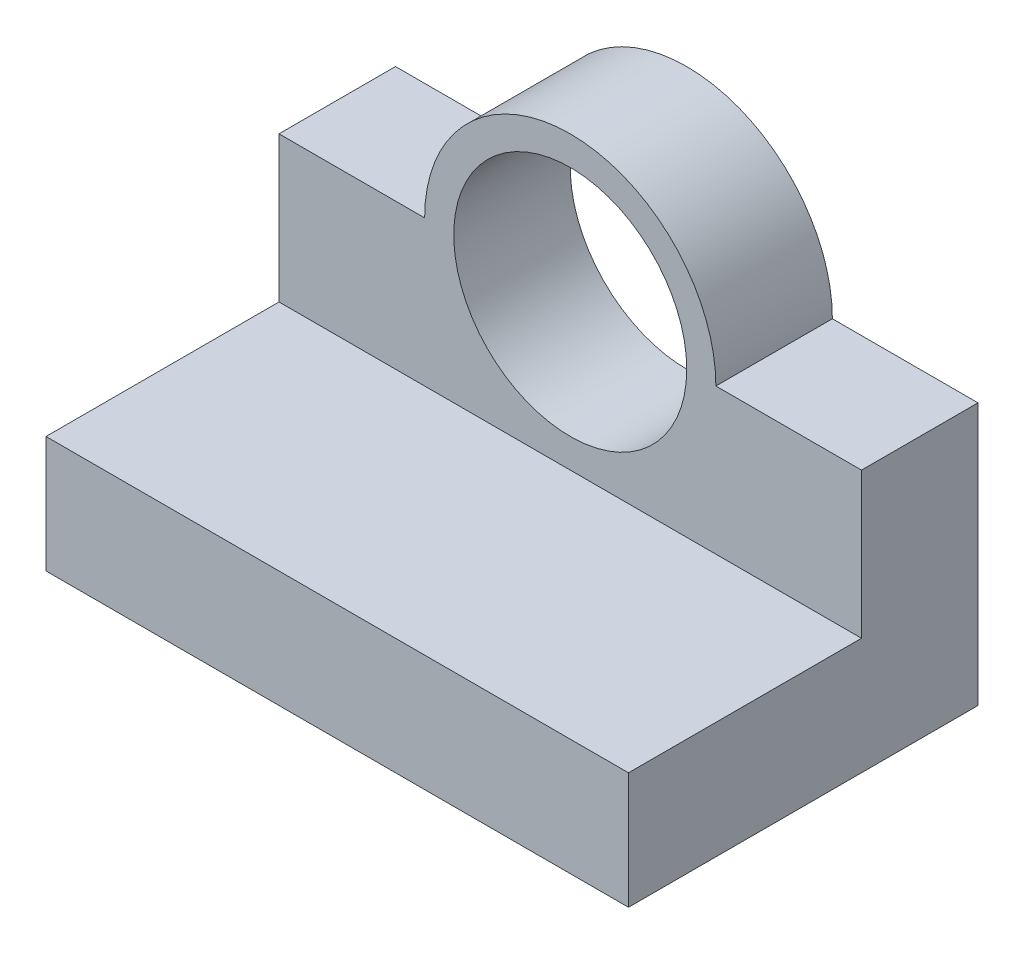
ISO-10303-21;
HEADER;
FILE_DESCRIPTION(('STEP AP214'),'2;1');
FILE_NAME('part.step','',(''),(''),'','','');
FILE_SCHEMA(('AUTOMOTIVE_DESIGN { 1 0 10303 214 1 1 1 1 }'));
ENDSEC;
DATA;
#1=APPLICATION_CONTEXT('core data for automotive mechanical design processes');
#2=APPLICATION_PROTOCOL_DEFINITION('international standard','automotive_design',2000,#1);
#3=PRODUCT_CONTEXT('',#1,'mechanical');
#4=PRODUCT('Part','Part','',(#3));
#5=PRODUCT_RELATED_PRODUCT_CATEGORY('part','',(#4));
#6=PRODUCT_DEFINITION_FORMATION('','',#4);
#7=PRODUCT_DEFINITION_CONTEXT('part definition',#1,'design');
#8=PRODUCT_DEFINITION('design','',#6,#7);
#9=PRODUCT_DEFINITION_SHAPE('','',#8);
#10=(LENGTH_UNIT() NAMED_UNIT(*) SI_UNIT(.MILLI.,.METRE.));
#11=(NAMED_UNIT(*) PLANE_ANGLE_UNIT() SI_UNIT($,.RADIAN.));
#12=(NAMED_UNIT(*) SI_UNIT($,.STERADIAN.) SOLID_ANGLE_UNIT());
#13=UNCERTAINTY_MEASURE_WITH_UNIT(LENGTH_MEASURE(1.E-05),#10,'distance_accuracy_value','');
#14=(GEOMETRIC_REPRESENTATION_CONTEXT(3) GLOBAL_UNCERTAINTY_ASSIGNED_CONTEXT((#13)) GLOBAL_UNIT_ASSIGNED_CONTEXT((#10,
#11,#12)) REPRESENTATION_CONTEXT('',''));
#15=CARTESIAN_POINT('',(0.,0.,0.));
#16=DIRECTION('',(0.,0.,1.));
#17=DIRECTION('',(1.,0.,0.));
#18=AXIS2_PLACEMENT_3D('',#15,#16,#17);
#19=CARTESIAN_POINT('',(0.,45.,0.));
#20=DIRECTION('',(0.,-1.,0.));
#21=DIRECTION('',(0.,0.,-1.));
#22=AXIS2_PLACEMENT_3D('',#19,#20,#21);
#23=PLANE('',#22);
#24=DIRECTION('',(-1.,0.,0.));
#25=VECTOR('',#24,1.);
#26=CARTESIAN_POINT('',(-50.,45.,-30.));
#27=LINE('',#26,#25);
#28=CARTESIAN_POINT('',(50.,45.,-30.));
#29=VERTEX_POINT('',#28);
#30=CARTESIAN_POINT('',(25.,45.,-30.));
#31=VERTEX_POINT('',#30);
#32=EDGE_CURVE('E116',#29,#31,#27,.T.);
#33=ORIENTED_EDGE('',*,*,#32,.T.);
#34=DIRECTION('',(0.,0.,1.));
#35=VECTOR('',#34,1.);
#36=CARTESIAN_POINT('',(25.,45.,-100.710678118655));
#37=LINE('',#36,#35);
#38=CARTESIAN_POINT('',(25.,45.,-9.99999999999999));
#39=VERTEX_POINT('',#38);
#40=EDGE_CURVE('E11',#31,#39,#37,.T.);
#41=ORIENTED_EDGE('',*,*,#40,.T.);
#42=DIRECTION('',(1.,0.,0.));
#43=VECTOR('',#42,1.);
#44=CARTESIAN_POINT('',(-50.,45.,-9.99999999999999));
#45=LINE('',#44,#43);
#46=CARTESIAN_POINT('',(50.,45.,-9.99999999999999));
#47=VERTEX_POINT('',#46);
#48=EDGE_CURVE('E150',#39,#47,#45,.T.);
#49=ORIENTED_EDGE('',*,*,#48,.T.);
#50=DIRECTION('',(0.,0.,-1.));
#51=VECTOR('',#50,1.);
#52=CARTESIAN_POINT('',(50.,45.,-9.99999999999999));
#53=LINE('',#52,#51);
#54=EDGE_CURVE('E117',#47,#29,#53,.T.);
#55=ORIENTED_EDGE('',*,*,#54,.T.);
#56=EDGE_LOOP('',(#33,#41,#49,#55));
#57=FACE_BOUND('',#56,.T.);
#58=ADVANCED_FACE('F41',(#57),#23,.F.);
#59=CARTESIAN_POINT('',(50.,20.,-30.));
#60=DIRECTION('',(-1.,0.,0.));
#61=DIRECTION('',(0.,0.,1.));
#62=AXIS2_PLACEMENT_3D('',#59,#60,#61);
#63=PLANE('',#62);
#64=DIRECTION('',(0.,0.,-1.));
#65=VECTOR('',#64,1.);
#66=CARTESIAN_POINT('',(50.,0.,-30.));
#67=LINE('',#66,#65);
#68=CARTESIAN_POINT('',(50.,0.,30.));
#69=VERTEX_POINT('',#68);
#70=CARTESIAN_POINT('',(50.,0.,-30.));
#71=VERTEX_POINT('',#70);
#72=EDGE_CURVE('E161',#69,#71,#67,.T.);
#73=ORIENTED_EDGE('',*,*,#72,.T.);
#74=DIRECTION('',(0.,-1.,0.));
#75=VECTOR('',#74,1.);
#76=CARTESIAN_POINT('',(50.,20.,-30.));
#77=LINE('',#76,#75);
#78=EDGE_CURVE('E124',#29,#71,#77,.T.);
#79=ORIENTED_EDGE('',*,*,#78,.F.);
#80=ORIENTED_EDGE('',*,*,#54,.F.);
#81=DIRECTION('',(0.,-1.,0.));
#82=VECTOR('',#81,1.);
#83=CARTESIAN_POINT('',(50.,45.,-9.99999999999999));
#84=LINE('',#83,#82);
#85=CARTESIAN_POINT('',(50.,20.,-9.99999999999999));
#86=VERTEX_POINT('',#85);
#87=EDGE_CURVE('E152',#47,#86,#84,.T.);
#88=ORIENTED_EDGE('',*,*,#87,.T.);
#89=DIRECTION('',(0.,0.,-1.));
#90=VECTOR('',#89,1.);
#91=CARTESIAN_POINT('',(50.,20.,-30.));
#92=LINE('',#91,#90);
#93=CARTESIAN_POINT('',(50.,20.,30.));
#94=VERTEX_POINT('',#93);
#95=EDGE_CURVE('E162',#94,#86,#92,.T.);
#96=ORIENTED_EDGE('',*,*,#95,.F.);
#97=DIRECTION('',(0.,-1.,0.));
#98=VECTOR('',#97,1.);
#99=CARTESIAN_POINT('',(50.,20.,30.));
#100=LINE('',#99,#98);
#101=EDGE_CURVE('E173',#94,#69,#100,.T.);
#102=ORIENTED_EDGE('',*,*,#101,.T.);
#103=EDGE_LOOP('',(#73,#79,#80,#88,#96,#102));
#104=FACE_BOUND('',#103,.T.);
#105=ADVANCED_FACE('F43',(#104),#63,.F.);
#106=CARTESIAN_POINT('',(-50.,20.,-30.));
#107=DIRECTION('',(0.,0.,1.));
#108=DIRECTION('',(1.,0.,0.));
#109=AXIS2_PLACEMENT_3D('',#106,#107,#108);
#110=PLANE('',#109);
#111=CARTESIAN_POINT('',(-25.,45.,-30.));
#112=VERTEX_POINT('',#111);
#113=CARTESIAN_POINT('',(-50.,45.,-30.));
#114=VERTEX_POINT('',#113);
#115=EDGE_CURVE('E106',#112,#114,#27,.T.);
#116=ORIENTED_EDGE('',*,*,#115,.F.);
#117=CARTESIAN_POINT('',(0.,45.,-30.));
#118=DIRECTION('',(0.,0.,1.));
#119=DIRECTION('',(1.,0.,0.));
#120=AXIS2_PLACEMENT_3D('',#117,#118,#119);
#121=CIRCLE('',#120,25.);
#122=EDGE_CURVE('E111',#112,#31,#121,.F.);
#123=ORIENTED_EDGE('',*,*,#122,.T.);
#124=ORIENTED_EDGE('',*,*,#32,.F.);
#125=ORIENTED_EDGE('',*,*,#78,.T.);
#126=DIRECTION('',(-1.,0.,0.));
#127=VECTOR('',#126,1.);
#128=CARTESIAN_POINT('',(-50.,0.,-30.));
#129=LINE('',#128,#127);
#130=CARTESIAN_POINT('',(-50.,0.,-30.));
#131=VERTEX_POINT('',#130);
#132=EDGE_CURVE('E177',#71,#131,#129,.T.);
#133=ORIENTED_EDGE('',*,*,#132,.T.);
#134=DIRECTION('',(0.,-1.,0.));
#135=VECTOR('',#134,1.);
#136=CARTESIAN_POINT('',(-50.,20.,-30.));
#137=LINE('',#136,#135);
#138=EDGE_CURVE('E113',#114,#131,#137,.T.);
#139=ORIENTED_EDGE('',*,*,#138,.F.);
#140=EDGE_LOOP('',(#116,#123,#124,#125,#133,#139));
#141=FACE_BOUND('',#140,.T.);
#142=CARTESIAN_POINT('',(0.,45.,-30.));
#143=DIRECTION('',(0.,0.,1.));
#144=DIRECTION('',(1.,0.,0.));
#145=AXIS2_PLACEMENT_3D('',#142,#143,#144);
#146=CIRCLE('',#145,20.);
#147=CARTESIAN_POINT('',(20.,45.,-30.));
#148=VERTEX_POINT('',#147);
#149=EDGE_CURVE('E128',#148,#148,#146,.F.);
#150=ORIENTED_EDGE('',*,*,#149,.F.);
#151=EDGE_LOOP('',(#150));
#152=FACE_BOUND('',#151,.T.);
#153=ADVANCED_FACE('F107',(#141,#152),#110,.F.);
#154=CARTESIAN_POINT('',(-50.,20.,-30.));
#155=DIRECTION('',(1.,0.,0.));
#156=DIRECTION('',(0.,0.,-1.));
#157=AXIS2_PLACEMENT_3D('',#154,#155,#156);
#158=PLANE('',#157);
#159=DIRECTION('',(0.,0.,1.));
#160=VECTOR('',#159,1.);
#161=CARTESIAN_POINT('',(-50.,0.,-30.));
#162=LINE('',#161,#160);
#163=CARTESIAN_POINT('',(-50.,0.,30.));
#164=VERTEX_POINT('',#163);
#165=EDGE_CURVE('E180',#131,#164,#162,.T.);
#166=ORIENTED_EDGE('',*,*,#165,.T.);
#167=DIRECTION('',(0.,-1.,0.));
#168=VECTOR('',#167,1.);
#169=CARTESIAN_POINT('',(-50.,20.,30.));
#170=LINE('',#169,#168);
#171=CARTESIAN_POINT('',(-50.,20.,30.));
#172=VERTEX_POINT('',#171);
#173=EDGE_CURVE('E188',#172,#164,#170,.T.);
#174=ORIENTED_EDGE('',*,*,#173,.F.);
#175=DIRECTION('',(0.,0.,1.));
#176=VECTOR('',#175,1.);
#177=CARTESIAN_POINT('',(-50.,20.,-30.));
#178=LINE('',#177,#176);
#179=CARTESIAN_POINT('',(-50.,20.,-9.99999999999999));
#180=VERTEX_POINT('',#179);
#181=EDGE_CURVE('E166',#180,#172,#178,.T.);
#182=ORIENTED_EDGE('',*,*,#181,.F.);
#183=DIRECTION('',(0.,-1.,0.));
#184=VECTOR('',#183,1.);
#185=CARTESIAN_POINT('',(-50.,45.,-9.99999999999999));
#186=LINE('',#185,#184);
#187=CARTESIAN_POINT('',(-50.,45.,-9.99999999999999));
#188=VERTEX_POINT('',#187);
#189=EDGE_CURVE('E157',#188,#180,#186,.T.);
#190=ORIENTED_EDGE('',*,*,#189,.F.);
#191=DIRECTION('',(0.,0.,1.));
#192=VECTOR('',#191,1.);
#193=CARTESIAN_POINT('',(-50.,45.,-9.99999999999999));
#194=LINE('',#193,#192);
#195=EDGE_CURVE('E147',#114,#188,#194,.T.);
#196=ORIENTED_EDGE('',*,*,#195,.F.);
#197=ORIENTED_EDGE('',*,*,#138,.T.);
#198=EDGE_LOOP('',(#166,#174,#182,#190,#196,#197));
#199=FACE_BOUND('',#198,.T.);
#200=ADVANCED_FACE('F207',(#199),#158,.F.);
#201=CARTESIAN_POINT('',(-50.,20.,30.));
#202=DIRECTION('',(0.,0.,-1.));
#203=DIRECTION('',(-1.,0.,0.));
#204=AXIS2_PLACEMENT_3D('',#201,#202,#203);
#205=PLANE('',#204);
#206=DIRECTION('',(1.,0.,0.));
#207=VECTOR('',#206,1.);
#208=CARTESIAN_POINT('',(-50.,0.,30.));
#209=LINE('',#208,#207);
#210=EDGE_CURVE('E167',#164,#69,#209,.T.);
#211=ORIENTED_EDGE('',*,*,#210,.T.);
#212=ORIENTED_EDGE('',*,*,#101,.F.);
#213=DIRECTION('',(1.,0.,0.));
#214=VECTOR('',#213,1.);
#215=CARTESIAN_POINT('',(-50.,20.,30.));
#216=LINE('',#215,#214);
#217=EDGE_CURVE('E170',#172,#94,#216,.T.);
#218=ORIENTED_EDGE('',*,*,#217,.F.);
#219=ORIENTED_EDGE('',*,*,#173,.T.);
#220=EDGE_LOOP('',(#211,#212,#218,#219));
#221=FACE_BOUND('',#220,.T.);
#222=ADVANCED_FACE('F211',(#221),#205,.F.);
#223=CARTESIAN_POINT('',(0.,20.,0.));
#224=DIRECTION('',(0.,1.,0.));
#225=DIRECTION('',(0.,0.,1.));
#226=AXIS2_PLACEMENT_3D('',#223,#224,#225);
#227=PLANE('',#226);
#228=DIRECTION('',(1.,0.,0.));
#229=VECTOR('',#228,1.);
#230=CARTESIAN_POINT('',(-50.,20.,-9.99999999999999));
#231=LINE('',#230,#229);
#232=EDGE_CURVE('E127',#180,#86,#231,.T.);
#233=ORIENTED_EDGE('',*,*,#232,.F.);
#234=ORIENTED_EDGE('',*,*,#181,.T.);
#235=ORIENTED_EDGE('',*,*,#217,.T.);
#236=ORIENTED_EDGE('',*,*,#95,.T.);
#237=EDGE_LOOP('',(#233,#234,#235,#236));
#238=FACE_BOUND('',#237,.T.);
#239=ADVANCED_FACE('F213',(#238),#227,.T.);
#240=CARTESIAN_POINT('',(0.,0.,0.));
#241=DIRECTION('',(0.,1.,0.));
#242=DIRECTION('',(0.,0.,1.));
#243=AXIS2_PLACEMENT_3D('',#240,#241,#242);
#244=PLANE('',#243);
#245=ORIENTED_EDGE('',*,*,#72,.F.);
#246=ORIENTED_EDGE('',*,*,#210,.F.);
#247=ORIENTED_EDGE('',*,*,#165,.F.);
#248=ORIENTED_EDGE('',*,*,#132,.F.);
#249=EDGE_LOOP('',(#245,#246,#247,#248));
#250=FACE_BOUND('',#249,.T.);
#251=ADVANCED_FACE('F203',(#250),#244,.F.);
#252=CARTESIAN_POINT('',(-50.,45.,-9.99999999999999));
#253=DIRECTION('',(0.,0.,-1.));
#254=DIRECTION('',(-1.,0.,0.));
#255=AXIS2_PLACEMENT_3D('',#252,#253,#254);
#256=PLANE('',#255);
#257=ORIENTED_EDGE('',*,*,#232,.T.);
#258=ORIENTED_EDGE('',*,*,#87,.F.);
#259=ORIENTED_EDGE('',*,*,#48,.F.);
#260=CARTESIAN_POINT('',(0.,45.,-9.99999999999999));
#261=DIRECTION('',(0.,0.,1.));
#262=DIRECTION('',(1.,0.,0.));
#263=AXIS2_PLACEMENT_3D('',#260,#261,#262);
#264=CIRCLE('',#263,25.);
#265=CARTESIAN_POINT('',(-25.,45.,-9.99999999999999));
#266=VERTEX_POINT('',#265);
#267=EDGE_CURVE('E134',#39,#266,#264,.T.);
#268=ORIENTED_EDGE('',*,*,#267,.T.);
#269=EDGE_CURVE('E63',#188,#266,#45,.T.);
#270=ORIENTED_EDGE('',*,*,#269,.F.);
#271=ORIENTED_EDGE('',*,*,#189,.T.);
#272=EDGE_LOOP('',(#257,#258,#259,#268,#270,#271));
#273=FACE_BOUND('',#272,.T.);
#274=CARTESIAN_POINT('',(0.,45.,-9.99999999999999));
#275=DIRECTION('',(0.,0.,1.));
#276=DIRECTION('',(1.,0.,0.));
#277=AXIS2_PLACEMENT_3D('',#274,#275,#276);
#278=CIRCLE('',#277,20.);
#279=CARTESIAN_POINT('',(20.,45.,-9.99999999999999));
#280=VERTEX_POINT('',#279);
#281=EDGE_CURVE('E137',#280,#280,#278,.T.);
#282=ORIENTED_EDGE('',*,*,#281,.F.);
#283=EDGE_LOOP('',(#282));
#284=FACE_BOUND('',#283,.T.);
#285=ADVANCED_FACE('F216',(#273,#284),#256,.F.);
#286=ORIENTED_EDGE('',*,*,#269,.T.);
#287=DIRECTION('',(0.,0.,1.));
#288=VECTOR('',#287,1.);
#289=CARTESIAN_POINT('',(-25.,45.,-100.710678118655));
#290=LINE('',#289,#288);
#291=EDGE_CURVE('E50',#266,#112,#290,.F.);
#292=ORIENTED_EDGE('',*,*,#291,.T.);
#293=ORIENTED_EDGE('',*,*,#115,.T.);
#294=ORIENTED_EDGE('',*,*,#195,.T.);
#295=EDGE_LOOP('',(#286,#292,#293,#294));
#296=FACE_BOUND('',#295,.T.);
#297=ADVANCED_FACE('F119',(#296),#23,.F.);
#298=CARTESIAN_POINT('',(0.,45.,-100.710678118655));
#299=DIRECTION('',(0.,0.,1.));
#300=DIRECTION('',(1.,0.,0.));
#301=AXIS2_PLACEMENT_3D('',#298,#299,#300);
#302=CYLINDRICAL_SURFACE('',#301,25.);
#303=ORIENTED_EDGE('',*,*,#40,.F.);
#304=ORIENTED_EDGE('',*,*,#122,.F.);
#305=ORIENTED_EDGE('',*,*,#291,.F.);
#306=ORIENTED_EDGE('',*,*,#267,.F.);
#307=EDGE_LOOP('',(#303,#304,#305,#306));
#308=FACE_BOUND('',#307,.T.);
#309=ADVANCED_FACE('F125',(#308),#302,.T.);
#310=CARTESIAN_POINT('',(0.,45.,-100.710678118655));
#311=DIRECTION('',(0.,0.,1.));
#312=DIRECTION('',(1.,0.,0.));
#313=AXIS2_PLACEMENT_3D('',#310,#311,#312);
#314=CYLINDRICAL_SURFACE('',#313,20.);
#315=ORIENTED_EDGE('',*,*,#281,.T.);
#316=EDGE_LOOP('',(#315));
#317=FACE_BOUND('',#316,.T.);
#318=ORIENTED_EDGE('',*,*,#149,.T.);
#319=EDGE_LOOP('',(#318));
#320=FACE_BOUND('',#319,.T.);
#321=ADVANCED_FACE('F232',(#317,#320),#314,.F.);
#322=CLOSED_SHELL('',(#58,#105,#153,#200,#222,#239,#251,#285,#297,#309,#321));
#323=MANIFOLD_SOLID_BREP('B2',#322);
#324=ADVANCED_BREP_SHAPE_REPRESENTATION('',(#18,#323),#14);
#325=SHAPE_DEFINITION_REPRESENTATION(#9,#324);
ENDSEC;
END-ISO-10303-21;
